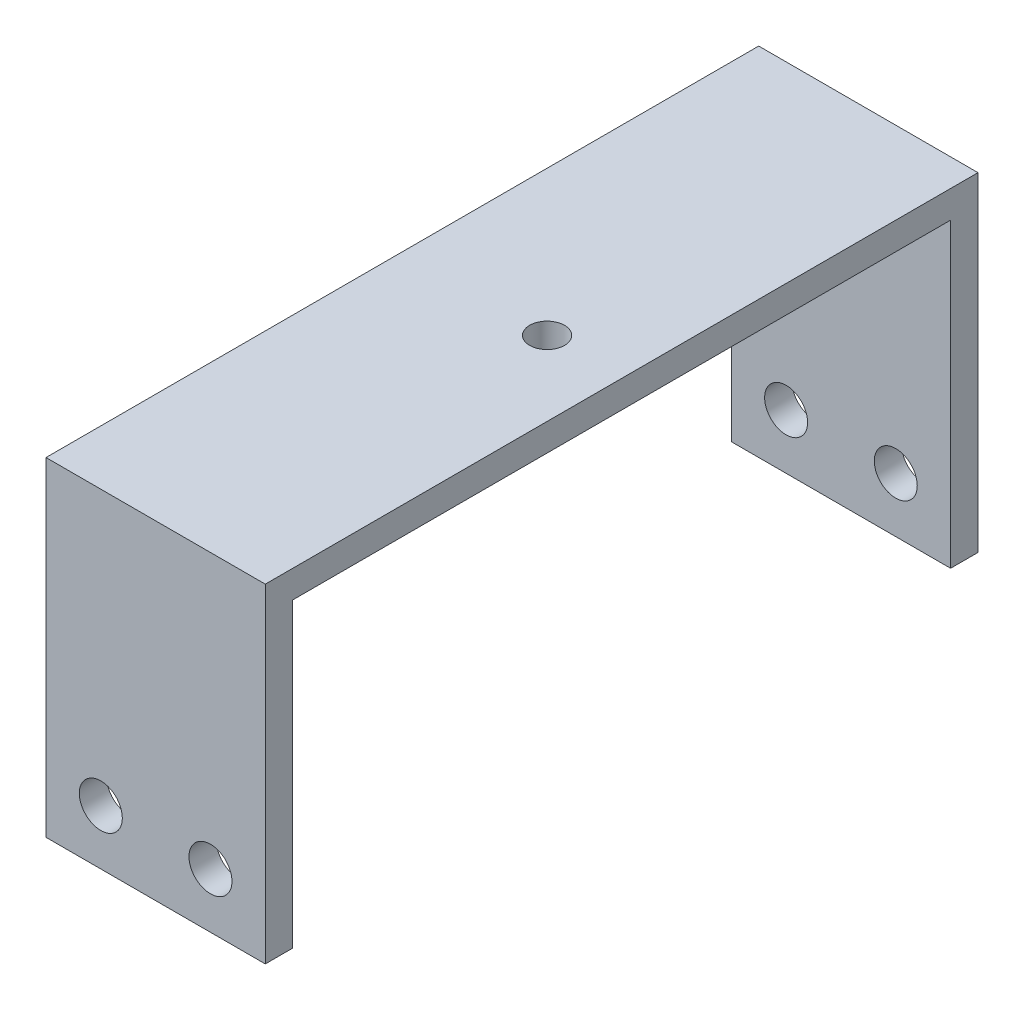
ISO-10303-21;
HEADER;
FILE_DESCRIPTION(('STEP AP214'),'2;1');
FILE_NAME('part.step','',(''),(''),'','','');
FILE_SCHEMA(('AUTOMOTIVE_DESIGN { 1 0 10303 214 1 1 1 1 }'));
ENDSEC;
DATA;
#1=APPLICATION_CONTEXT('core data for automotive mechanical design processes');
#2=APPLICATION_PROTOCOL_DEFINITION('international standard','automotive_design',2000,#1);
#3=PRODUCT_CONTEXT('',#1,'mechanical');
#4=PRODUCT('Part','Part','',(#3));
#5=PRODUCT_RELATED_PRODUCT_CATEGORY('part','',(#4));
#6=PRODUCT_DEFINITION_FORMATION('','',#4);
#7=PRODUCT_DEFINITION_CONTEXT('part definition',#1,'design');
#8=PRODUCT_DEFINITION('design','',#6,#7);
#9=PRODUCT_DEFINITION_SHAPE('','',#8);
#10=(LENGTH_UNIT() NAMED_UNIT(*) SI_UNIT(.MILLI.,.METRE.));
#11=(NAMED_UNIT(*) PLANE_ANGLE_UNIT() SI_UNIT($,.RADIAN.));
#12=(NAMED_UNIT(*) SI_UNIT($,.STERADIAN.) SOLID_ANGLE_UNIT());
#13=UNCERTAINTY_MEASURE_WITH_UNIT(LENGTH_MEASURE(1.E-05),#10,'distance_accuracy_value','');
#14=(GEOMETRIC_REPRESENTATION_CONTEXT(3) GLOBAL_UNCERTAINTY_ASSIGNED_CONTEXT((#13)) GLOBAL_UNIT_ASSIGNED_CONTEXT((#10,
#11,#12)) REPRESENTATION_CONTEXT('',''));
#15=CARTESIAN_POINT('',(0.,0.,0.));
#16=DIRECTION('',(0.,0.,1.));
#17=DIRECTION('',(1.,0.,0.));
#18=AXIS2_PLACEMENT_3D('',#15,#16,#17);
#19=CARTESIAN_POINT('',(25.4,0.,0.));
#20=DIRECTION('',(0.,0.,-1.));
#21=DIRECTION('',(-1.,0.,0.));
#22=AXIS2_PLACEMENT_3D('',#19,#20,#21);
#23=PLANE('',#22);
#24=CARTESIAN_POINT('',(6.35,6.35,0.));
#25=DIRECTION('',(0.,0.,1.));
#26=DIRECTION('',(1.,0.,0.));
#27=AXIS2_PLACEMENT_3D('',#24,#25,#26);
#28=CIRCLE('',#27,2.48919999999999);
#29=CARTESIAN_POINT('',(8.83919999999999,6.35,0.));
#30=VERTEX_POINT('',#29);
#31=EDGE_CURVE('E205',#30,#30,#28,.T.);
#32=ORIENTED_EDGE('',*,*,#31,.F.);
#33=EDGE_LOOP('',(#32));
#34=FACE_BOUND('',#33,.T.);
#35=CARTESIAN_POINT('',(19.05,6.35,0.));
#36=DIRECTION('',(0.,0.,1.));
#37=DIRECTION('',(1.,0.,0.));
#38=AXIS2_PLACEMENT_3D('',#35,#36,#37);
#39=CIRCLE('',#38,2.48919999999999);
#40=CARTESIAN_POINT('',(21.5392,6.35,0.));
#41=VERTEX_POINT('',#40);
#42=EDGE_CURVE('E193',#41,#41,#39,.T.);
#43=ORIENTED_EDGE('',*,*,#42,.F.);
#44=EDGE_LOOP('',(#43));
#45=FACE_BOUND('',#44,.T.);
#46=DIRECTION('',(0.,-1.,0.));
#47=VECTOR('',#46,1.);
#48=CARTESIAN_POINT('',(0.,0.,0.));
#49=LINE('',#48,#47);
#50=CARTESIAN_POINT('',(0.,38.1,0.));
#51=VERTEX_POINT('',#50);
#52=CARTESIAN_POINT('',(0.,0.,0.));
#53=VERTEX_POINT('',#52);
#54=EDGE_CURVE('E131',#51,#53,#49,.T.);
#55=ORIENTED_EDGE('',*,*,#54,.T.);
#56=DIRECTION('',(-1.,0.,0.));
#57=VECTOR('',#56,1.);
#58=CARTESIAN_POINT('',(25.4,0.,0.));
#59=LINE('',#58,#57);
#60=CARTESIAN_POINT('',(25.4,0.,0.));
#61=VERTEX_POINT('',#60);
#62=EDGE_CURVE('E11',#61,#53,#59,.T.);
#63=ORIENTED_EDGE('',*,*,#62,.F.);
#64=DIRECTION('',(0.,-1.,0.));
#65=VECTOR('',#64,1.);
#66=CARTESIAN_POINT('',(25.4,0.,0.));
#67=LINE('',#66,#65);
#68=CARTESIAN_POINT('',(25.4,38.1,0.));
#69=VERTEX_POINT('',#68);
#70=EDGE_CURVE('E146',#69,#61,#67,.T.);
#71=ORIENTED_EDGE('',*,*,#70,.F.);
#72=DIRECTION('',(-1.,0.,0.));
#73=VECTOR('',#72,1.);
#74=CARTESIAN_POINT('',(25.4,38.1,0.));
#75=LINE('',#74,#73);
#76=EDGE_CURVE('E127',#69,#51,#75,.T.);
#77=ORIENTED_EDGE('',*,*,#76,.T.);
#78=EDGE_LOOP('',(#55,#63,#71,#77));
#79=FACE_BOUND('',#78,.T.);
#80=ADVANCED_FACE('F35',(#34,#45,#79),#23,.F.);
#81=CARTESIAN_POINT('',(25.4,0.,0.));
#82=DIRECTION('',(0.,1.,0.));
#83=DIRECTION('',(0.,0.,1.));
#84=AXIS2_PLACEMENT_3D('',#81,#82,#83);
#85=PLANE('',#84);
#86=DIRECTION('',(0.,0.,-1.));
#87=VECTOR('',#86,1.);
#88=CARTESIAN_POINT('',(0.,0.,0.));
#89=LINE('',#88,#87);
#90=CARTESIAN_POINT('',(0.,0.,-3.175));
#91=VERTEX_POINT('',#90);
#92=EDGE_CURVE('E134',#53,#91,#89,.T.);
#93=ORIENTED_EDGE('',*,*,#92,.T.);
#94=DIRECTION('',(-1.,0.,0.));
#95=VECTOR('',#94,1.);
#96=CARTESIAN_POINT('',(25.4,0.,-3.175));
#97=LINE('',#96,#95);
#98=CARTESIAN_POINT('',(25.4,0.,-3.175));
#99=VERTEX_POINT('',#98);
#100=EDGE_CURVE('E43',#99,#91,#97,.T.);
#101=ORIENTED_EDGE('',*,*,#100,.F.);
#102=DIRECTION('',(0.,0.,-1.));
#103=VECTOR('',#102,1.);
#104=CARTESIAN_POINT('',(25.4,0.,0.));
#105=LINE('',#104,#103);
#106=EDGE_CURVE('E94',#61,#99,#105,.T.);
#107=ORIENTED_EDGE('',*,*,#106,.F.);
#108=ORIENTED_EDGE('',*,*,#62,.T.);
#109=EDGE_LOOP('',(#93,#101,#107,#108));
#110=FACE_BOUND('',#109,.T.);
#111=ADVANCED_FACE('F214',(#110),#85,.F.);
#112=CARTESIAN_POINT('',(25.4,0.,-3.175));
#113=DIRECTION('',(0.,0.,1.));
#114=DIRECTION('',(0.,-1.,0.));
#115=AXIS2_PLACEMENT_3D('',#112,#113,#114);
#116=PLANE('',#115);
#117=CARTESIAN_POINT('',(6.35,6.35,-3.175));
#118=DIRECTION('',(0.,0.,1.));
#119=DIRECTION('',(0.,-1.,0.));
#120=AXIS2_PLACEMENT_3D('',#117,#118,#119);
#121=CIRCLE('',#120,2.48919999999999);
#122=CARTESIAN_POINT('',(6.35,3.86080000000001,-3.175));
#123=VERTEX_POINT('',#122);
#124=EDGE_CURVE('E196',#123,#123,#121,.T.);
#125=ORIENTED_EDGE('',*,*,#124,.T.);
#126=EDGE_LOOP('',(#125));
#127=FACE_BOUND('',#126,.T.);
#128=CARTESIAN_POINT('',(19.05,6.35,-3.175));
#129=DIRECTION('',(0.,0.,1.));
#130=DIRECTION('',(0.,-1.,0.));
#131=AXIS2_PLACEMENT_3D('',#128,#129,#130);
#132=CIRCLE('',#131,2.48919999999999);
#133=CARTESIAN_POINT('',(19.05,3.86080000000001,-3.175));
#134=VERTEX_POINT('',#133);
#135=EDGE_CURVE('E187',#134,#134,#132,.T.);
#136=ORIENTED_EDGE('',*,*,#135,.T.);
#137=EDGE_LOOP('',(#136));
#138=FACE_BOUND('',#137,.T.);
#139=DIRECTION('',(0.,1.,0.));
#140=VECTOR('',#139,1.);
#141=CARTESIAN_POINT('',(0.,0.,-3.175));
#142=LINE('',#141,#140);
#143=CARTESIAN_POINT('',(0.,34.925,-3.175));
#144=VERTEX_POINT('',#143);
#145=EDGE_CURVE('E137',#91,#144,#142,.T.);
#146=ORIENTED_EDGE('',*,*,#145,.T.);
#147=DIRECTION('',(-1.,0.,0.));
#148=VECTOR('',#147,1.);
#149=CARTESIAN_POINT('',(25.4,34.925,-3.175));
#150=LINE('',#149,#148);
#151=CARTESIAN_POINT('',(25.4,34.925,-3.175));
#152=VERTEX_POINT('',#151);
#153=EDGE_CURVE('E153',#152,#144,#150,.T.);
#154=ORIENTED_EDGE('',*,*,#153,.F.);
#155=DIRECTION('',(0.,1.,0.));
#156=VECTOR('',#155,1.);
#157=CARTESIAN_POINT('',(25.4,0.,-3.175));
#158=LINE('',#157,#156);
#159=EDGE_CURVE('E161',#99,#152,#158,.T.);
#160=ORIENTED_EDGE('',*,*,#159,.F.);
#161=ORIENTED_EDGE('',*,*,#100,.T.);
#162=EDGE_LOOP('',(#146,#154,#160,#161));
#163=FACE_BOUND('',#162,.T.);
#164=ADVANCED_FACE('F159',(#127,#138,#163),#116,.F.);
#165=CARTESIAN_POINT('',(25.4,34.925,-3.175));
#166=DIRECTION('',(0.,1.,0.));
#167=DIRECTION('',(0.,0.,1.));
#168=AXIS2_PLACEMENT_3D('',#165,#166,#167);
#169=PLANE('',#168);
#170=CARTESIAN_POINT('',(16.764,34.925,-41.275));
#171=DIRECTION('',(0.,1.,0.));
#172=DIRECTION('',(0.,0.,1.));
#173=AXIS2_PLACEMENT_3D('',#170,#171,#172);
#174=CIRCLE('',#173,2.01929999999999);
#175=CARTESIAN_POINT('',(16.764,34.925,-39.2557));
#176=VERTEX_POINT('',#175);
#177=EDGE_CURVE('E135',#176,#176,#174,.T.);
#178=ORIENTED_EDGE('',*,*,#177,.T.);
#179=EDGE_LOOP('',(#178));
#180=FACE_BOUND('',#179,.T.);
#181=DIRECTION('',(0.,0.,-1.));
#182=VECTOR('',#181,1.);
#183=CARTESIAN_POINT('',(0.,34.925,-3.175));
#184=LINE('',#183,#182);
#185=CARTESIAN_POINT('',(0.,34.925,-79.375));
#186=VERTEX_POINT('',#185);
#187=EDGE_CURVE('E139',#144,#186,#184,.T.);
#188=ORIENTED_EDGE('',*,*,#187,.T.);
#189=DIRECTION('',(-1.,0.,0.));
#190=VECTOR('',#189,1.);
#191=CARTESIAN_POINT('',(25.4,34.925,-79.375));
#192=LINE('',#191,#190);
#193=CARTESIAN_POINT('',(25.4,34.925,-79.375));
#194=VERTEX_POINT('',#193);
#195=EDGE_CURVE('E150',#194,#186,#192,.T.);
#196=ORIENTED_EDGE('',*,*,#195,.F.);
#197=DIRECTION('',(0.,0.,-1.));
#198=VECTOR('',#197,1.);
#199=CARTESIAN_POINT('',(25.4,34.925,-3.175));
#200=LINE('',#199,#198);
#201=EDGE_CURVE('E173',#152,#194,#200,.T.);
#202=ORIENTED_EDGE('',*,*,#201,.F.);
#203=ORIENTED_EDGE('',*,*,#153,.T.);
#204=EDGE_LOOP('',(#188,#196,#202,#203));
#205=FACE_BOUND('',#204,.T.);
#206=ADVANCED_FACE('F169',(#180,#205),#169,.F.);
#207=CARTESIAN_POINT('',(25.4,34.925,-79.375));
#208=DIRECTION('',(0.,0.,-1.));
#209=DIRECTION('',(-1.,0.,0.));
#210=AXIS2_PLACEMENT_3D('',#207,#208,#209);
#211=PLANE('',#210);
#212=CARTESIAN_POINT('',(6.35,6.35,-79.375));
#213=DIRECTION('',(0.,0.,-1.));
#214=DIRECTION('',(-1.,0.,0.));
#215=AXIS2_PLACEMENT_3D('',#212,#213,#214);
#216=CIRCLE('',#215,2.48919999999999);
#217=CARTESIAN_POINT('',(3.86080000000001,6.35,-79.375));
#218=VERTEX_POINT('',#217);
#219=EDGE_CURVE('E199',#218,#218,#216,.T.);
#220=ORIENTED_EDGE('',*,*,#219,.T.);
#221=EDGE_LOOP('',(#220));
#222=FACE_BOUND('',#221,.T.);
#223=CARTESIAN_POINT('',(19.05,6.35,-79.375));
#224=DIRECTION('',(0.,0.,-1.));
#225=DIRECTION('',(-1.,0.,0.));
#226=AXIS2_PLACEMENT_3D('',#223,#224,#225);
#227=CIRCLE('',#226,2.48919999999999);
#228=CARTESIAN_POINT('',(16.5608,6.35,-79.375));
#229=VERTEX_POINT('',#228);
#230=EDGE_CURVE('E184',#229,#229,#227,.T.);
#231=ORIENTED_EDGE('',*,*,#230,.T.);
#232=EDGE_LOOP('',(#231));
#233=FACE_BOUND('',#232,.T.);
#234=DIRECTION('',(0.,-1.,0.));
#235=VECTOR('',#234,1.);
#236=CARTESIAN_POINT('',(0.,34.925,-79.375));
#237=LINE('',#236,#235);
#238=CARTESIAN_POINT('',(0.,0.,-79.375));
#239=VERTEX_POINT('',#238);
#240=EDGE_CURVE('E141',#186,#239,#237,.T.);
#241=ORIENTED_EDGE('',*,*,#240,.T.);
#242=DIRECTION('',(-1.,0.,0.));
#243=VECTOR('',#242,1.);
#244=CARTESIAN_POINT('',(25.4,0.,-79.375));
#245=LINE('',#244,#243);
#246=CARTESIAN_POINT('',(25.4,0.,-79.375));
#247=VERTEX_POINT('',#246);
#248=EDGE_CURVE('E122',#247,#239,#245,.T.);
#249=ORIENTED_EDGE('',*,*,#248,.F.);
#250=DIRECTION('',(0.,-1.,0.));
#251=VECTOR('',#250,1.);
#252=CARTESIAN_POINT('',(25.4,34.925,-79.375));
#253=LINE('',#252,#251);
#254=EDGE_CURVE('E113',#194,#247,#253,.T.);
#255=ORIENTED_EDGE('',*,*,#254,.F.);
#256=ORIENTED_EDGE('',*,*,#195,.T.);
#257=EDGE_LOOP('',(#241,#249,#255,#256));
#258=FACE_BOUND('',#257,.T.);
#259=ADVANCED_FACE('F172',(#222,#233,#258),#211,.F.);
#260=CARTESIAN_POINT('',(25.4,0.,-82.55));
#261=DIRECTION('',(0.,1.,0.));
#262=DIRECTION('',(0.,0.,1.));
#263=AXIS2_PLACEMENT_3D('',#260,#261,#262);
#264=PLANE('',#263);
#265=DIRECTION('',(0.,0.,-1.));
#266=VECTOR('',#265,1.);
#267=CARTESIAN_POINT('',(0.,0.,-82.55));
#268=LINE('',#267,#266);
#269=CARTESIAN_POINT('',(0.,0.,-82.55));
#270=VERTEX_POINT('',#269);
#271=EDGE_CURVE('E121',#239,#270,#268,.T.);
#272=ORIENTED_EDGE('',*,*,#271,.T.);
#273=DIRECTION('',(-1.,0.,0.));
#274=VECTOR('',#273,1.);
#275=CARTESIAN_POINT('',(25.4,0.,-82.55));
#276=LINE('',#275,#274);
#277=CARTESIAN_POINT('',(25.4,0.,-82.55));
#278=VERTEX_POINT('',#277);
#279=EDGE_CURVE('E118',#278,#270,#276,.T.);
#280=ORIENTED_EDGE('',*,*,#279,.F.);
#281=DIRECTION('',(0.,0.,-1.));
#282=VECTOR('',#281,1.);
#283=CARTESIAN_POINT('',(25.4,0.,-82.55));
#284=LINE('',#283,#282);
#285=EDGE_CURVE('E107',#247,#278,#284,.T.);
#286=ORIENTED_EDGE('',*,*,#285,.F.);
#287=ORIENTED_EDGE('',*,*,#248,.T.);
#288=EDGE_LOOP('',(#272,#280,#286,#287));
#289=FACE_BOUND('',#288,.T.);
#290=ADVANCED_FACE('F119',(#289),#264,.F.);
#291=CARTESIAN_POINT('',(25.4,0.,-82.55));
#292=DIRECTION('',(0.,0.,1.));
#293=DIRECTION('',(1.,0.,0.));
#294=AXIS2_PLACEMENT_3D('',#291,#292,#293);
#295=PLANE('',#294);
#296=CARTESIAN_POINT('',(6.35,6.35,-82.55));
#297=DIRECTION('',(0.,0.,1.));
#298=DIRECTION('',(1.,0.,0.));
#299=AXIS2_PLACEMENT_3D('',#296,#297,#298);
#300=CIRCLE('',#299,2.48919999999999);
#301=CARTESIAN_POINT('',(8.83919999999998,6.35,-82.55));
#302=VERTEX_POINT('',#301);
#303=EDGE_CURVE('E202',#302,#302,#300,.T.);
#304=ORIENTED_EDGE('',*,*,#303,.T.);
#305=EDGE_LOOP('',(#304));
#306=FACE_BOUND('',#305,.T.);
#307=CARTESIAN_POINT('',(19.05,6.35,-82.55));
#308=DIRECTION('',(0.,0.,1.));
#309=DIRECTION('',(1.,0.,0.));
#310=AXIS2_PLACEMENT_3D('',#307,#308,#309);
#311=CIRCLE('',#310,2.48919999999999);
#312=CARTESIAN_POINT('',(21.5392,6.35,-82.55));
#313=VERTEX_POINT('',#312);
#314=EDGE_CURVE('E190',#313,#313,#311,.T.);
#315=ORIENTED_EDGE('',*,*,#314,.T.);
#316=EDGE_LOOP('',(#315));
#317=FACE_BOUND('',#316,.T.);
#318=DIRECTION('',(0.,1.,0.));
#319=VECTOR('',#318,1.);
#320=CARTESIAN_POINT('',(0.,0.,-82.55));
#321=LINE('',#320,#319);
#322=CARTESIAN_POINT('',(0.,38.1,-82.55));
#323=VERTEX_POINT('',#322);
#324=EDGE_CURVE('E80',#270,#323,#321,.T.);
#325=ORIENTED_EDGE('',*,*,#324,.T.);
#326=DIRECTION('',(-1.,0.,0.));
#327=VECTOR('',#326,1.);
#328=CARTESIAN_POINT('',(25.4,38.1,-82.55));
#329=LINE('',#328,#327);
#330=CARTESIAN_POINT('',(25.4,38.1,-82.55));
#331=VERTEX_POINT('',#330);
#332=EDGE_CURVE('E123',#331,#323,#329,.T.);
#333=ORIENTED_EDGE('',*,*,#332,.F.);
#334=DIRECTION('',(0.,1.,0.));
#335=VECTOR('',#334,1.);
#336=CARTESIAN_POINT('',(25.4,0.,-82.55));
#337=LINE('',#336,#335);
#338=EDGE_CURVE('E111',#278,#331,#337,.T.);
#339=ORIENTED_EDGE('',*,*,#338,.F.);
#340=ORIENTED_EDGE('',*,*,#279,.T.);
#341=EDGE_LOOP('',(#325,#333,#339,#340));
#342=FACE_BOUND('',#341,.T.);
#343=ADVANCED_FACE('F125',(#306,#317,#342),#295,.F.);
#344=CARTESIAN_POINT('',(25.4,38.1,0.));
#345=DIRECTION('',(0.,-1.,0.));
#346=DIRECTION('',(0.,0.,-1.));
#347=AXIS2_PLACEMENT_3D('',#344,#345,#346);
#348=PLANE('',#347);
#349=CARTESIAN_POINT('',(16.764,38.1,-41.275));
#350=DIRECTION('',(0.,1.,0.));
#351=DIRECTION('',(0.,0.,1.));
#352=AXIS2_PLACEMENT_3D('',#349,#350,#351);
#353=CIRCLE('',#352,2.01929999999999);
#354=CARTESIAN_POINT('',(16.764,38.1,-39.2557));
#355=VERTEX_POINT('',#354);
#356=EDGE_CURVE('E181',#355,#355,#353,.T.);
#357=ORIENTED_EDGE('',*,*,#356,.F.);
#358=EDGE_LOOP('',(#357));
#359=FACE_BOUND('',#358,.T.);
#360=DIRECTION('',(0.,0.,1.));
#361=VECTOR('',#360,1.);
#362=CARTESIAN_POINT('',(0.,38.1,0.));
#363=LINE('',#362,#361);
#364=EDGE_CURVE('E86',#323,#51,#363,.T.);
#365=ORIENTED_EDGE('',*,*,#364,.T.);
#366=ORIENTED_EDGE('',*,*,#76,.F.);
#367=DIRECTION('',(0.,0.,1.));
#368=VECTOR('',#367,1.);
#369=CARTESIAN_POINT('',(25.4,38.1,0.));
#370=LINE('',#369,#368);
#371=EDGE_CURVE('E51',#331,#69,#370,.T.);
#372=ORIENTED_EDGE('',*,*,#371,.F.);
#373=ORIENTED_EDGE('',*,*,#332,.T.);
#374=EDGE_LOOP('',(#365,#366,#372,#373));
#375=FACE_BOUND('',#374,.T.);
#376=ADVANCED_FACE('F219',(#359,#375),#348,.F.);
#377=CARTESIAN_POINT('',(25.4,0.,0.));
#378=DIRECTION('',(-1.,0.,0.));
#379=DIRECTION('',(0.,0.,1.));
#380=AXIS2_PLACEMENT_3D('',#377,#378,#379);
#381=PLANE('',#380);
#382=ORIENTED_EDGE('',*,*,#70,.T.);
#383=ORIENTED_EDGE('',*,*,#106,.T.);
#384=ORIENTED_EDGE('',*,*,#159,.T.);
#385=ORIENTED_EDGE('',*,*,#201,.T.);
#386=ORIENTED_EDGE('',*,*,#254,.T.);
#387=ORIENTED_EDGE('',*,*,#285,.T.);
#388=ORIENTED_EDGE('',*,*,#338,.T.);
#389=ORIENTED_EDGE('',*,*,#371,.T.);
#390=EDGE_LOOP('',(#382,#383,#384,#385,#386,#387,#388,#389));
#391=FACE_BOUND('',#390,.T.);
#392=ADVANCED_FACE('F109',(#391),#381,.F.);
#393=CARTESIAN_POINT('',(0.,0.,0.));
#394=DIRECTION('',(-1.,0.,0.));
#395=DIRECTION('',(0.,0.,1.));
#396=AXIS2_PLACEMENT_3D('',#393,#394,#395);
#397=PLANE('',#396);
#398=ORIENTED_EDGE('',*,*,#54,.F.);
#399=ORIENTED_EDGE('',*,*,#364,.F.);
#400=ORIENTED_EDGE('',*,*,#324,.F.);
#401=ORIENTED_EDGE('',*,*,#271,.F.);
#402=ORIENTED_EDGE('',*,*,#240,.F.);
#403=ORIENTED_EDGE('',*,*,#187,.F.);
#404=ORIENTED_EDGE('',*,*,#145,.F.);
#405=ORIENTED_EDGE('',*,*,#92,.F.);
#406=EDGE_LOOP('',(#398,#399,#400,#401,#402,#403,#404,#405));
#407=FACE_BOUND('',#406,.T.);
#408=ADVANCED_FACE('F165',(#407),#397,.T.);
#409=CARTESIAN_POINT('',(16.764,38.1,-41.275));
#410=DIRECTION('',(0.,1.,0.));
#411=DIRECTION('',(0.,0.,1.));
#412=AXIS2_PLACEMENT_3D('',#409,#410,#411);
#413=CYLINDRICAL_SURFACE('',#412,2.01929999999999);
#414=ORIENTED_EDGE('',*,*,#356,.T.);
#415=EDGE_LOOP('',(#414));
#416=FACE_BOUND('',#415,.T.);
#417=ORIENTED_EDGE('',*,*,#177,.F.);
#418=EDGE_LOOP('',(#417));
#419=FACE_BOUND('',#418,.T.);
#420=ADVANCED_FACE('F293',(#416,#419),#413,.F.);
#421=CARTESIAN_POINT('',(19.05,6.35,0.));
#422=DIRECTION('',(0.,0.,1.));
#423=DIRECTION('',(1.,0.,0.));
#424=AXIS2_PLACEMENT_3D('',#421,#422,#423);
#425=CYLINDRICAL_SURFACE('',#424,2.48919999999999);
#426=ORIENTED_EDGE('',*,*,#314,.F.);
#427=EDGE_LOOP('',(#426));
#428=FACE_BOUND('',#427,.T.);
#429=ORIENTED_EDGE('',*,*,#230,.F.);
#430=EDGE_LOOP('',(#429));
#431=FACE_BOUND('',#430,.T.);
#432=ADVANCED_FACE('F299',(#428,#431),#425,.F.);
#433=ORIENTED_EDGE('',*,*,#42,.T.);
#434=EDGE_LOOP('',(#433));
#435=FACE_BOUND('',#434,.T.);
#436=ORIENTED_EDGE('',*,*,#135,.F.);
#437=EDGE_LOOP('',(#436));
#438=FACE_BOUND('',#437,.T.);
#439=ADVANCED_FACE('F305',(#435,#438),#425,.F.);
#440=CARTESIAN_POINT('',(6.35,6.35,0.));
#441=DIRECTION('',(0.,0.,1.));
#442=DIRECTION('',(1.,0.,0.));
#443=AXIS2_PLACEMENT_3D('',#440,#441,#442);
#444=CYLINDRICAL_SURFACE('',#443,2.48919999999999);
#445=ORIENTED_EDGE('',*,*,#303,.F.);
#446=EDGE_LOOP('',(#445));
#447=FACE_BOUND('',#446,.T.);
#448=ORIENTED_EDGE('',*,*,#219,.F.);
#449=EDGE_LOOP('',(#448));
#450=FACE_BOUND('',#449,.T.);
#451=ADVANCED_FACE('F313',(#447,#450),#444,.F.);
#452=ORIENTED_EDGE('',*,*,#31,.T.);
#453=EDGE_LOOP('',(#452));
#454=FACE_BOUND('',#453,.T.);
#455=ORIENTED_EDGE('',*,*,#124,.F.);
#456=EDGE_LOOP('',(#455));
#457=FACE_BOUND('',#456,.T.);
#458=ADVANCED_FACE('F209',(#454,#457),#444,.F.);
#459=CLOSED_SHELL('',(#80,#111,#164,#206,#259,#290,#343,#376,#392,#408,#420,#432,#439,#451,#458));
#460=MANIFOLD_SOLID_BREP('B2',#459);
#461=ADVANCED_BREP_SHAPE_REPRESENTATION('',(#18,#460),#14);
#462=SHAPE_DEFINITION_REPRESENTATION(#9,#461);
ENDSEC;
END-ISO-10303-21;
